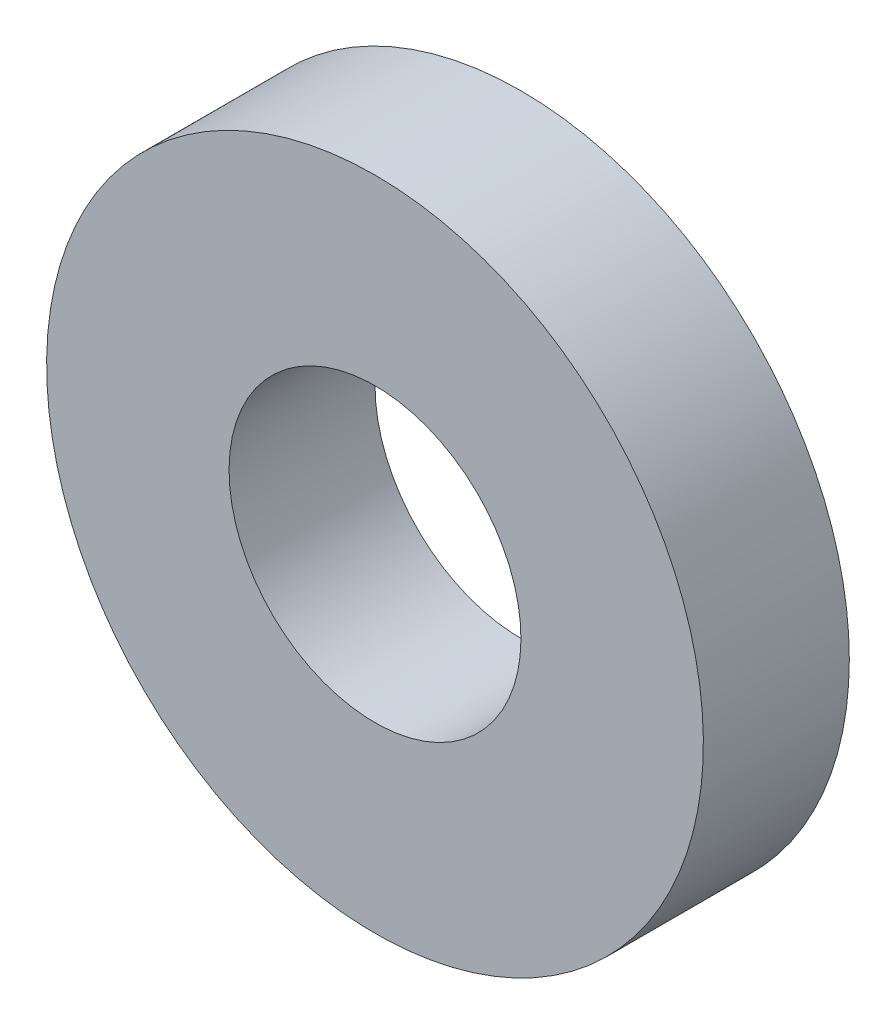
ISO-10303-21;
HEADER;
FILE_DESCRIPTION(('STEP AP214'),'2;1');
FILE_NAME('part.step','',(''),(''),'','','');
FILE_SCHEMA(('AUTOMOTIVE_DESIGN { 1 0 10303 214 1 1 1 1 }'));
ENDSEC;
DATA;
#1=APPLICATION_CONTEXT('core data for automotive mechanical design processes');
#2=APPLICATION_PROTOCOL_DEFINITION('international standard','automotive_design',2000,#1);
#3=PRODUCT_CONTEXT('',#1,'mechanical');
#4=PRODUCT('Part','Part','',(#3));
#5=PRODUCT_RELATED_PRODUCT_CATEGORY('part','',(#4));
#6=PRODUCT_DEFINITION_FORMATION('','',#4);
#7=PRODUCT_DEFINITION_CONTEXT('part definition',#1,'design');
#8=PRODUCT_DEFINITION('design','',#6,#7);
#9=PRODUCT_DEFINITION_SHAPE('','',#8);
#10=(LENGTH_UNIT() NAMED_UNIT(*) SI_UNIT(.MILLI.,.METRE.));
#11=(NAMED_UNIT(*) PLANE_ANGLE_UNIT() SI_UNIT($,.RADIAN.));
#12=(NAMED_UNIT(*) SI_UNIT($,.STERADIAN.) SOLID_ANGLE_UNIT());
#13=UNCERTAINTY_MEASURE_WITH_UNIT(LENGTH_MEASURE(1.E-05),#10,'distance_accuracy_value','');
#14=(GEOMETRIC_REPRESENTATION_CONTEXT(3) GLOBAL_UNCERTAINTY_ASSIGNED_CONTEXT((#13)) GLOBAL_UNIT_ASSIGNED_CONTEXT((#10,
#11,#12)) REPRESENTATION_CONTEXT('',''));
#15=CARTESIAN_POINT('',(0.,0.,0.));
#16=DIRECTION('',(0.,0.,1.));
#17=DIRECTION('',(1.,0.,0.));
#18=AXIS2_PLACEMENT_3D('',#15,#16,#17);
#19=CARTESIAN_POINT('',(0.,0.,0.));
#20=DIRECTION('',(0.,0.,1.));
#21=DIRECTION('',(1.,0.,0.));
#22=AXIS2_PLACEMENT_3D('',#19,#20,#21);
#23=PLANE('',#22);
#24=CARTESIAN_POINT('',(0.,0.,0.));
#25=DIRECTION('',(0.,0.,1.));
#26=DIRECTION('',(1.,0.,0.));
#27=AXIS2_PLACEMENT_3D('',#24,#25,#26);
#28=CIRCLE('',#27,8.99999999988136);
#29=CARTESIAN_POINT('',(8.99999999988131,0.,0.));
#30=VERTEX_POINT('',#29);
#31=EDGE_CURVE('E38',#30,#30,#28,.T.);
#32=ORIENTED_EDGE('',*,*,#31,.F.);
#33=EDGE_LOOP('',(#32));
#34=FACE_BOUND('',#33,.T.);
#35=CARTESIAN_POINT('',(0.,0.,0.));
#36=DIRECTION('',(0.,0.,1.));
#37=DIRECTION('',(1.,0.,0.));
#38=AXIS2_PLACEMENT_3D('',#35,#36,#37);
#39=CIRCLE('',#38,3.99999999988137);
#40=CARTESIAN_POINT('',(3.99999999988132,0.,0.));
#41=VERTEX_POINT('',#40);
#42=EDGE_CURVE('E47',#41,#41,#39,.T.);
#43=ORIENTED_EDGE('',*,*,#42,.T.);
#44=EDGE_LOOP('',(#43));
#45=FACE_BOUND('',#44,.T.);
#46=ADVANCED_FACE('F31',(#34,#45),#23,.F.);
#47=CARTESIAN_POINT('',(0.,0.,29.45584412238));
#48=DIRECTION('',(0.,0.,-1.));
#49=DIRECTION('',(-1.,0.,0.));
#50=AXIS2_PLACEMENT_3D('',#47,#48,#49);
#51=CYLINDRICAL_SURFACE('',#50,8.99999999988136);
#52=CARTESIAN_POINT('',(0.,0.,3.99999999999981));
#53=DIRECTION('',(0.,0.,-1.));
#54=DIRECTION('',(0.,1.,0.));
#55=AXIS2_PLACEMENT_3D('',#52,#53,#54);
#56=CIRCLE('',#55,8.99999999988136);
#57=CARTESIAN_POINT('',(0.,8.99999999988136,3.99999999999981));
#58=VERTEX_POINT('',#57);
#59=EDGE_CURVE('E42',#58,#58,#56,.T.);
#60=ORIENTED_EDGE('',*,*,#59,.T.);
#61=EDGE_LOOP('',(#60));
#62=FACE_BOUND('',#61,.T.);
#63=ORIENTED_EDGE('',*,*,#31,.T.);
#64=EDGE_LOOP('',(#63));
#65=FACE_BOUND('',#64,.T.);
#66=ADVANCED_FACE('F55',(#62,#65),#51,.T.);
#67=CARTESIAN_POINT('',(0.,0.,29.45584412238));
#68=DIRECTION('',(0.,0.,-1.));
#69=DIRECTION('',(-1.,0.,0.));
#70=AXIS2_PLACEMENT_3D('',#67,#68,#69);
#71=CYLINDRICAL_SURFACE('',#70,3.99999999988137);
#72=CARTESIAN_POINT('',(-1.17961196366423E-12,-6.82787160144471E-12,3.99999999999981));
#73=DIRECTION('',(0.,0.,-1.));
#74=DIRECTION('',(-0.0580168543245278,-0.998315603711715,0.));
#75=AXIS2_PLACEMENT_3D('',#72,#73,#74);
#76=CIRCLE('',#75,3.99999999999999);
#77=CARTESIAN_POINT('',(-0.23206741729929,-3.99326241485368,3.99999999999981));
#78=VERTEX_POINT('',#77);
#79=EDGE_CURVE('E10',#78,#78,#76,.T.);
#80=ORIENTED_EDGE('',*,*,#79,.F.);
#81=EDGE_LOOP('',(#80));
#82=FACE_BOUND('',#81,.T.);
#83=ORIENTED_EDGE('',*,*,#42,.F.);
#84=EDGE_LOOP('',(#83));
#85=FACE_BOUND('',#84,.T.);
#86=ADVANCED_FACE('F53',(#82,#85),#71,.F.);
#87=CARTESIAN_POINT('',(-17.4050562973595,-299.494681113521,3.99999999999983));
#88=DIRECTION('',(0.,0.,-1.));
#89=DIRECTION('',(-0.0580168543245278,-0.998315603711715,0.));
#90=AXIS2_PLACEMENT_3D('',#87,#88,#89);
#91=PLANE('',#90);
#92=ORIENTED_EDGE('',*,*,#79,.T.);
#93=EDGE_LOOP('',(#92));
#94=FACE_BOUND('',#93,.T.);
#95=ORIENTED_EDGE('',*,*,#59,.F.);
#96=EDGE_LOOP('',(#95));
#97=FACE_BOUND('',#96,.T.);
#98=ADVANCED_FACE('F33',(#94,#97),#91,.F.);
#99=CLOSED_SHELL('',(#46,#66,#86,#98));
#100=MANIFOLD_SOLID_BREP('B2',#99);
#101=ADVANCED_BREP_SHAPE_REPRESENTATION('',(#18,#100),#14);
#102=SHAPE_DEFINITION_REPRESENTATION(#9,#101);
ENDSEC;
END-ISO-10303-21;
